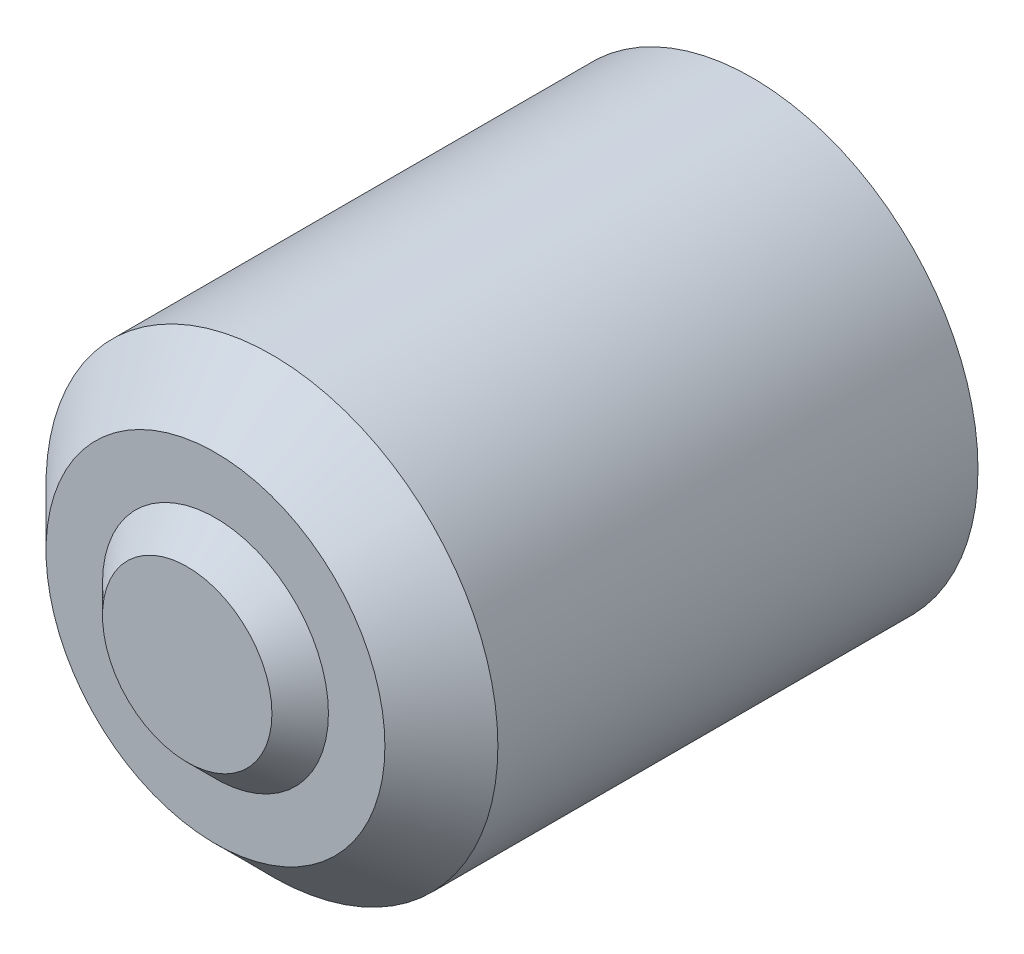
ISO-10303-21;
HEADER;
FILE_DESCRIPTION(('STEP AP214'),'2;1');
FILE_NAME('part.step','',(''),(''),'','','');
FILE_SCHEMA(('AUTOMOTIVE_DESIGN { 1 0 10303 214 1 1 1 1 }'));
ENDSEC;
DATA;
#1=APPLICATION_CONTEXT('core data for automotive mechanical design processes');
#2=APPLICATION_PROTOCOL_DEFINITION('international standard','automotive_design',2000,#1);
#3=PRODUCT_CONTEXT('',#1,'mechanical');
#4=PRODUCT('Part','Part','',(#3));
#5=PRODUCT_RELATED_PRODUCT_CATEGORY('part','',(#4));
#6=PRODUCT_DEFINITION_FORMATION('','',#4);
#7=PRODUCT_DEFINITION_CONTEXT('part definition',#1,'design');
#8=PRODUCT_DEFINITION('design','',#6,#7);
#9=PRODUCT_DEFINITION_SHAPE('','',#8);
#10=(LENGTH_UNIT() NAMED_UNIT(*) SI_UNIT(.MILLI.,.METRE.));
#11=(NAMED_UNIT(*) PLANE_ANGLE_UNIT() SI_UNIT($,.RADIAN.));
#12=(NAMED_UNIT(*) SI_UNIT($,.STERADIAN.) SOLID_ANGLE_UNIT());
#13=UNCERTAINTY_MEASURE_WITH_UNIT(LENGTH_MEASURE(1.E-05),#10,'distance_accuracy_value','');
#14=(GEOMETRIC_REPRESENTATION_CONTEXT(3) GLOBAL_UNCERTAINTY_ASSIGNED_CONTEXT((#13)) GLOBAL_UNIT_ASSIGNED_CONTEXT((#10,
#11,#12)) REPRESENTATION_CONTEXT('',''));
#15=CARTESIAN_POINT('',(0.,0.,0.));
#16=DIRECTION('',(0.,0.,1.));
#17=DIRECTION('',(1.,0.,0.));
#18=AXIS2_PLACEMENT_3D('',#15,#16,#17);
#19=CARTESIAN_POINT('',(0.,0.,-30.));
#20=DIRECTION('',(0.,0.,1.));
#21=DIRECTION('',(1.,0.,0.));
#22=AXIS2_PLACEMENT_3D('',#19,#20,#21);
#23=CYLINDRICAL_SURFACE('',#22,12.);
#24=CARTESIAN_POINT('',(0.,0.,-30.));
#25=DIRECTION('',(0.,0.,1.));
#26=DIRECTION('',(1.,0.,0.));
#27=AXIS2_PLACEMENT_3D('',#24,#25,#26);
#28=CIRCLE('',#27,12.);
#29=CARTESIAN_POINT('',(12.,0.,-30.));
#30=VERTEX_POINT('',#29);
#31=EDGE_CURVE('E10',#30,#30,#28,.T.);
#32=ORIENTED_EDGE('',*,*,#31,.T.);
#33=EDGE_LOOP('',(#32));
#34=FACE_BOUND('',#33,.T.);
#35=CARTESIAN_POINT('',(0.,0.,-4.5));
#36=DIRECTION('',(0.,0.,1.));
#37=DIRECTION('',(1.,0.,0.));
#38=AXIS2_PLACEMENT_3D('',#35,#36,#37);
#39=CIRCLE('',#38,12.);
#40=CARTESIAN_POINT('',(12.,0.,-4.5));
#41=VERTEX_POINT('',#40);
#42=EDGE_CURVE('E51',#41,#41,#39,.T.);
#43=ORIENTED_EDGE('',*,*,#42,.F.);
#44=EDGE_LOOP('',(#43));
#45=FACE_BOUND('',#44,.T.);
#46=ADVANCED_FACE('F32',(#34,#45),#23,.T.);
#47=CARTESIAN_POINT('',(12.,0.,-30.));
#48=DIRECTION('',(0.,0.,-1.));
#49=DIRECTION('',(-1.,0.,0.));
#50=AXIS2_PLACEMENT_3D('',#47,#48,#49);
#51=PLANE('',#50);
#52=ORIENTED_EDGE('',*,*,#31,.F.);
#53=EDGE_LOOP('',(#52));
#54=FACE_BOUND('',#53,.T.);
#55=ADVANCED_FACE('F59',(#54),#51,.T.);
#56=CARTESIAN_POINT('',(0.,0.,0.));
#57=DIRECTION('',(0.,0.,1.));
#58=DIRECTION('',(1.,0.,0.));
#59=AXIS2_PLACEMENT_3D('',#56,#57,#58);
#60=PLANE('',#59);
#61=CARTESIAN_POINT('',(0.,0.,0.));
#62=DIRECTION('',(0.,0.,1.));
#63=DIRECTION('',(1.,0.,0.));
#64=AXIS2_PLACEMENT_3D('',#61,#62,#63);
#65=CIRCLE('',#64,4.5);
#66=CARTESIAN_POINT('',(4.5,0.,0.));
#67=VERTEX_POINT('',#66);
#68=EDGE_CURVE('E38',#67,#67,#65,.T.);
#69=ORIENTED_EDGE('',*,*,#68,.T.);
#70=EDGE_LOOP('',(#69));
#71=FACE_BOUND('',#70,.T.);
#72=ADVANCED_FACE('F63',(#71),#60,.T.);
#73=CARTESIAN_POINT('',(0.,0.,0.));
#74=DIRECTION('',(0.,0.,-1.));
#75=DIRECTION('',(-1.,0.,0.));
#76=AXIS2_PLACEMENT_3D('',#73,#74,#75);
#77=CONICAL_SURFACE('',#76,4.5,0.785398163397448);
#78=CARTESIAN_POINT('',(0.,0.,-1.5));
#79=DIRECTION('',(0.,0.,1.));
#80=DIRECTION('',(1.,0.,0.));
#81=AXIS2_PLACEMENT_3D('',#78,#79,#80);
#82=CIRCLE('',#81,6.);
#83=CARTESIAN_POINT('',(6.,0.,-1.5));
#84=VERTEX_POINT('',#83);
#85=EDGE_CURVE('E42',#84,#84,#82,.T.);
#86=ORIENTED_EDGE('',*,*,#85,.T.);
#87=EDGE_LOOP('',(#86));
#88=FACE_BOUND('',#87,.T.);
#89=ORIENTED_EDGE('',*,*,#68,.F.);
#90=EDGE_LOOP('',(#89));
#91=FACE_BOUND('',#90,.T.);
#92=ADVANCED_FACE('F68',(#88,#91),#77,.T.);
#93=CARTESIAN_POINT('',(6.,0.,-1.5));
#94=DIRECTION('',(0.,0.,1.));
#95=DIRECTION('',(1.,0.,0.));
#96=AXIS2_PLACEMENT_3D('',#93,#94,#95);
#97=PLANE('',#96);
#98=CARTESIAN_POINT('',(0.,0.,-1.5));
#99=DIRECTION('',(0.,0.,1.));
#100=DIRECTION('',(1.,0.,0.));
#101=AXIS2_PLACEMENT_3D('',#98,#99,#100);
#102=CIRCLE('',#101,9.);
#103=CARTESIAN_POINT('',(9.,0.,-1.5));
#104=VERTEX_POINT('',#103);
#105=EDGE_CURVE('E46',#104,#104,#102,.T.);
#106=ORIENTED_EDGE('',*,*,#105,.T.);
#107=EDGE_LOOP('',(#106));
#108=FACE_BOUND('',#107,.T.);
#109=ORIENTED_EDGE('',*,*,#85,.F.);
#110=EDGE_LOOP('',(#109));
#111=FACE_BOUND('',#110,.T.);
#112=ADVANCED_FACE('F73',(#108,#111),#97,.T.);
#113=CARTESIAN_POINT('',(0.,0.,-1.5));
#114=DIRECTION('',(0.,0.,-1.));
#115=DIRECTION('',(-1.,0.,0.));
#116=AXIS2_PLACEMENT_3D('',#113,#114,#115);
#117=CONICAL_SURFACE('',#116,9.,0.785398163397448);
#118=ORIENTED_EDGE('',*,*,#42,.T.);
#119=EDGE_LOOP('',(#118));
#120=FACE_BOUND('',#119,.T.);
#121=ORIENTED_EDGE('',*,*,#105,.F.);
#122=EDGE_LOOP('',(#121));
#123=FACE_BOUND('',#122,.T.);
#124=ADVANCED_FACE('F55',(#120,#123),#117,.T.);
#125=CLOSED_SHELL('',(#46,#55,#72,#92,#112,#124));
#126=MANIFOLD_SOLID_BREP('B2',#125);
#127=ADVANCED_BREP_SHAPE_REPRESENTATION('',(#18,#126),#14);
#128=SHAPE_DEFINITION_REPRESENTATION(#9,#127);
ENDSEC;
END-ISO-10303-21;
